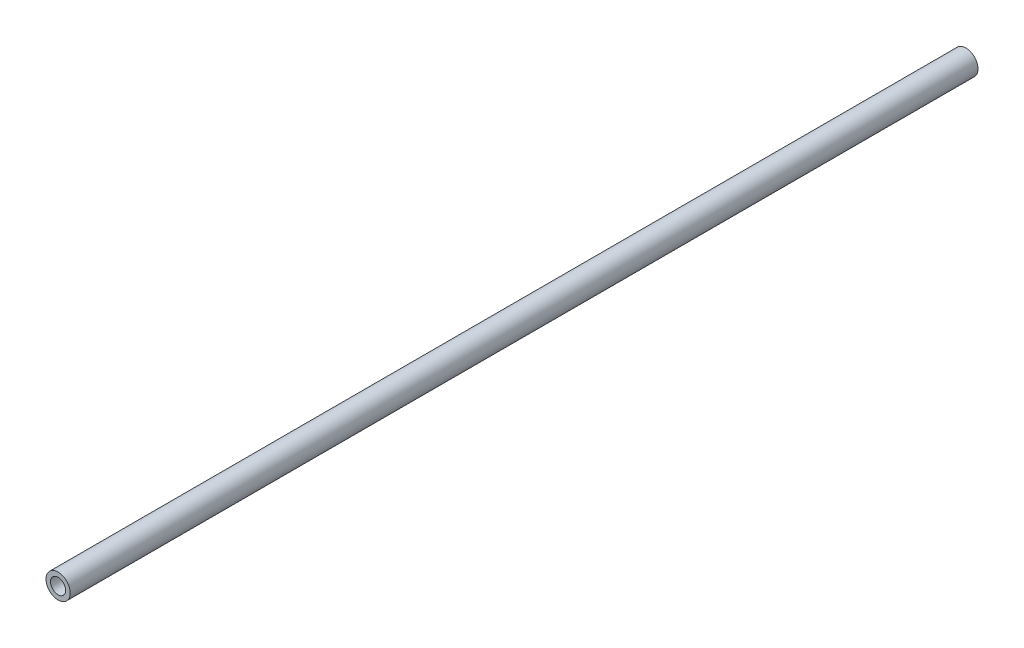
ISO-10303-21;
HEADER;
FILE_DESCRIPTION(('STEP AP214'),'2;1');
FILE_NAME('part.step','',(''),(''),'','','');
FILE_SCHEMA(('AUTOMOTIVE_DESIGN { 1 0 10303 214 1 1 1 1 }'));
ENDSEC;
DATA;
#1=APPLICATION_CONTEXT('core data for automotive mechanical design processes');
#2=APPLICATION_PROTOCOL_DEFINITION('international standard','automotive_design',2000,#1);
#3=PRODUCT_CONTEXT('',#1,'mechanical');
#4=PRODUCT('Part','Part','',(#3));
#5=PRODUCT_RELATED_PRODUCT_CATEGORY('part','',(#4));
#6=PRODUCT_DEFINITION_FORMATION('','',#4);
#7=PRODUCT_DEFINITION_CONTEXT('part definition',#1,'design');
#8=PRODUCT_DEFINITION('design','',#6,#7);
#9=PRODUCT_DEFINITION_SHAPE('','',#8);
#10=(LENGTH_UNIT() NAMED_UNIT(*) SI_UNIT(.MILLI.,.METRE.));
#11=(NAMED_UNIT(*) PLANE_ANGLE_UNIT() SI_UNIT($,.RADIAN.));
#12=(NAMED_UNIT(*) SI_UNIT($,.STERADIAN.) SOLID_ANGLE_UNIT());
#13=UNCERTAINTY_MEASURE_WITH_UNIT(LENGTH_MEASURE(1.E-05),#10,'distance_accuracy_value','');
#14=(GEOMETRIC_REPRESENTATION_CONTEXT(3) GLOBAL_UNCERTAINTY_ASSIGNED_CONTEXT((#13)) GLOBAL_UNIT_ASSIGNED_CONTEXT((#10,
#11,#12)) REPRESENTATION_CONTEXT('',''));
#15=CARTESIAN_POINT('',(0.,0.,0.));
#16=DIRECTION('',(0.,0.,1.));
#17=DIRECTION('',(1.,0.,0.));
#18=AXIS2_PLACEMENT_3D('',#15,#16,#17);
#19=CARTESIAN_POINT('',(0.,0.,600.));
#20=DIRECTION('',(0.,0.,1.));
#21=DIRECTION('',(1.,0.,0.));
#22=AXIS2_PLACEMENT_3D('',#19,#20,#21);
#23=PLANE('',#22);
#24=CARTESIAN_POINT('',(0.,0.,600.));
#25=DIRECTION('',(0.,0.,1.));
#26=DIRECTION('',(1.,0.,0.));
#27=AXIS2_PLACEMENT_3D('',#24,#25,#26);
#28=CIRCLE('',#27,8.);
#29=CARTESIAN_POINT('',(8.,0.,600.));
#30=VERTEX_POINT('',#29);
#31=EDGE_CURVE('E10',#30,#30,#28,.T.);
#32=ORIENTED_EDGE('',*,*,#31,.T.);
#33=EDGE_LOOP('',(#32));
#34=FACE_BOUND('',#33,.T.);
#35=CARTESIAN_POINT('',(0.,0.,600.));
#36=DIRECTION('',(0.,0.,1.));
#37=DIRECTION('',(1.,0.,0.));
#38=AXIS2_PLACEMENT_3D('',#35,#36,#37);
#39=CIRCLE('',#38,5.);
#40=CARTESIAN_POINT('',(5.,0.,600.));
#41=VERTEX_POINT('',#40);
#42=EDGE_CURVE('E45',#41,#41,#39,.T.);
#43=ORIENTED_EDGE('',*,*,#42,.F.);
#44=EDGE_LOOP('',(#43));
#45=FACE_BOUND('',#44,.T.);
#46=ADVANCED_FACE('F34',(#34,#45),#23,.T.);
#47=CARTESIAN_POINT('',(0.,0.,0.));
#48=DIRECTION('',(0.,0.,1.));
#49=DIRECTION('',(1.,0.,0.));
#50=AXIS2_PLACEMENT_3D('',#47,#48,#49);
#51=PLANE('',#50);
#52=CARTESIAN_POINT('',(0.,0.,0.));
#53=DIRECTION('',(0.,0.,1.));
#54=DIRECTION('',(1.,0.,0.));
#55=AXIS2_PLACEMENT_3D('',#52,#53,#54);
#56=CIRCLE('',#55,8.);
#57=CARTESIAN_POINT('',(8.,0.,0.));
#58=VERTEX_POINT('',#57);
#59=EDGE_CURVE('E38',#58,#58,#56,.T.);
#60=ORIENTED_EDGE('',*,*,#59,.F.);
#61=EDGE_LOOP('',(#60));
#62=FACE_BOUND('',#61,.T.);
#63=CARTESIAN_POINT('',(0.,0.,0.));
#64=DIRECTION('',(0.,0.,1.));
#65=DIRECTION('',(1.,0.,0.));
#66=AXIS2_PLACEMENT_3D('',#63,#64,#65);
#67=CIRCLE('',#66,5.);
#68=CARTESIAN_POINT('',(5.,0.,0.));
#69=VERTEX_POINT('',#68);
#70=EDGE_CURVE('E47',#69,#69,#67,.T.);
#71=ORIENTED_EDGE('',*,*,#70,.T.);
#72=EDGE_LOOP('',(#71));
#73=FACE_BOUND('',#72,.T.);
#74=ADVANCED_FACE('F57',(#62,#73),#51,.F.);
#75=CARTESIAN_POINT('',(0.,0.,600.));
#76=DIRECTION('',(0.,0.,-1.));
#77=DIRECTION('',(-1.,0.,0.));
#78=AXIS2_PLACEMENT_3D('',#75,#76,#77);
#79=CYLINDRICAL_SURFACE('',#78,8.);
#80=ORIENTED_EDGE('',*,*,#31,.F.);
#81=EDGE_LOOP('',(#80));
#82=FACE_BOUND('',#81,.T.);
#83=ORIENTED_EDGE('',*,*,#59,.T.);
#84=EDGE_LOOP('',(#83));
#85=FACE_BOUND('',#84,.T.);
#86=ADVANCED_FACE('F36',(#82,#85),#79,.T.);
#87=CARTESIAN_POINT('',(0.,0.,600.));
#88=DIRECTION('',(0.,0.,-1.));
#89=DIRECTION('',(-1.,0.,0.));
#90=AXIS2_PLACEMENT_3D('',#87,#88,#89);
#91=CYLINDRICAL_SURFACE('',#90,5.);
#92=ORIENTED_EDGE('',*,*,#42,.T.);
#93=EDGE_LOOP('',(#92));
#94=FACE_BOUND('',#93,.T.);
#95=ORIENTED_EDGE('',*,*,#70,.F.);
#96=EDGE_LOOP('',(#95));
#97=FACE_BOUND('',#96,.T.);
#98=ADVANCED_FACE('F53',(#94,#97),#91,.F.);
#99=CLOSED_SHELL('',(#46,#74,#86,#98));
#100=MANIFOLD_SOLID_BREP('B2',#99);
#101=ADVANCED_BREP_SHAPE_REPRESENTATION('',(#18,#100),#14);
#102=SHAPE_DEFINITION_REPRESENTATION(#9,#101);
ENDSEC;
END-ISO-10303-21;
